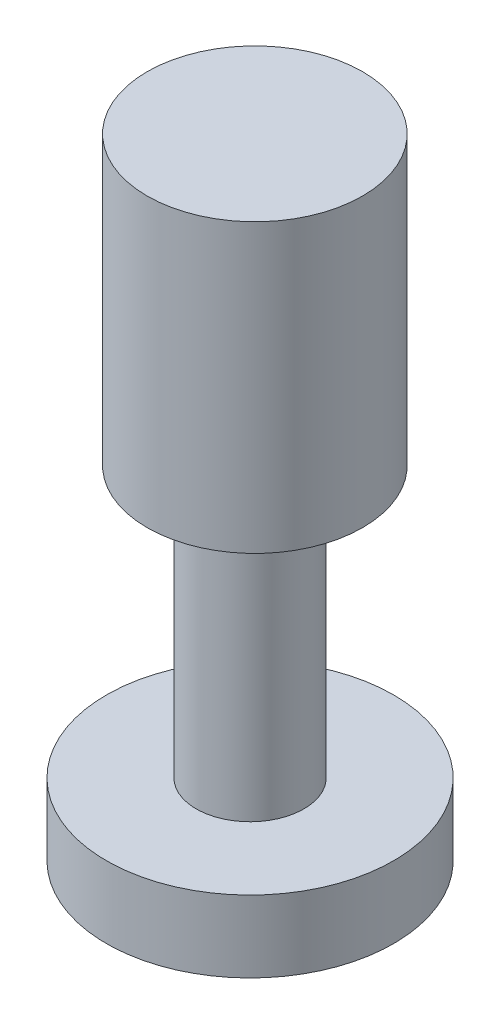
ISO-10303-21;
HEADER;
FILE_DESCRIPTION(('STEP AP214'),'2;1');
FILE_NAME('part.step','',(''),(''),'','','');
FILE_SCHEMA(('AUTOMOTIVE_DESIGN { 1 0 10303 214 1 1 1 1 }'));
ENDSEC;
DATA;
#1=APPLICATION_CONTEXT('core data for automotive mechanical design processes');
#2=APPLICATION_PROTOCOL_DEFINITION('international standard','automotive_design',2000,#1);
#3=PRODUCT_CONTEXT('',#1,'mechanical');
#4=PRODUCT('Part','Part','',(#3));
#5=PRODUCT_RELATED_PRODUCT_CATEGORY('part','',(#4));
#6=PRODUCT_DEFINITION_FORMATION('','',#4);
#7=PRODUCT_DEFINITION_CONTEXT('part definition',#1,'design');
#8=PRODUCT_DEFINITION('design','',#6,#7);
#9=PRODUCT_DEFINITION_SHAPE('','',#8);
#10=(LENGTH_UNIT() NAMED_UNIT(*) SI_UNIT(.MILLI.,.METRE.));
#11=(NAMED_UNIT(*) PLANE_ANGLE_UNIT() SI_UNIT($,.RADIAN.));
#12=(NAMED_UNIT(*) SI_UNIT($,.STERADIAN.) SOLID_ANGLE_UNIT());
#13=UNCERTAINTY_MEASURE_WITH_UNIT(LENGTH_MEASURE(1.E-05),#10,'distance_accuracy_value','');
#14=(GEOMETRIC_REPRESENTATION_CONTEXT(3) GLOBAL_UNCERTAINTY_ASSIGNED_CONTEXT((#13)) GLOBAL_UNIT_ASSIGNED_CONTEXT((#10,
#11,#12)) REPRESENTATION_CONTEXT('',''));
#15=CARTESIAN_POINT('',(0.,0.,0.));
#16=DIRECTION('',(0.,0.,1.));
#17=DIRECTION('',(1.,0.,0.));
#18=AXIS2_PLACEMENT_3D('',#15,#16,#17);
#19=CARTESIAN_POINT('',(0.,38.,0.));
#20=DIRECTION('',(0.,-1.,0.));
#21=DIRECTION('',(0.,0.,-1.));
#22=AXIS2_PLACEMENT_3D('',#19,#20,#21);
#23=CYLINDRICAL_SURFACE('',#22,7.5);
#24=CARTESIAN_POINT('',(0.,38.,0.));
#25=DIRECTION('',(0.,1.,0.));
#26=DIRECTION('',(0.,0.,1.));
#27=AXIS2_PLACEMENT_3D('',#24,#25,#26);
#28=CIRCLE('',#27,7.5);
#29=CARTESIAN_POINT('',(0.,38.,7.5));
#30=VERTEX_POINT('',#29);
#31=EDGE_CURVE('E10',#30,#30,#28,.T.);
#32=ORIENTED_EDGE('',*,*,#31,.F.);
#33=EDGE_LOOP('',(#32));
#34=FACE_BOUND('',#33,.T.);
#35=CARTESIAN_POINT('',(0.,0.,0.));
#36=DIRECTION('',(0.,-1.,0.));
#37=DIRECTION('',(0.,0.,-1.));
#38=AXIS2_PLACEMENT_3D('',#35,#36,#37);
#39=CIRCLE('',#38,7.5);
#40=CARTESIAN_POINT('',(0.,0.,-7.5));
#41=VERTEX_POINT('',#40);
#42=EDGE_CURVE('E37',#41,#41,#39,.T.);
#43=ORIENTED_EDGE('',*,*,#42,.F.);
#44=EDGE_LOOP('',(#43));
#45=FACE_BOUND('',#44,.T.);
#46=ADVANCED_FACE('F31',(#34,#45),#23,.T.);
#47=CARTESIAN_POINT('',(0.,-10.,0.));
#48=DIRECTION('',(0.,1.,0.));
#49=DIRECTION('',(0.,0.,1.));
#50=AXIS2_PLACEMENT_3D('',#47,#48,#49);
#51=CYLINDRICAL_SURFACE('',#50,20.);
#52=CARTESIAN_POINT('',(0.,-10.,0.));
#53=DIRECTION('',(0.,-1.,0.));
#54=DIRECTION('',(0.,0.,-1.));
#55=AXIS2_PLACEMENT_3D('',#52,#53,#54);
#56=CIRCLE('',#55,20.);
#57=CARTESIAN_POINT('',(0.,-10.,-20.));
#58=VERTEX_POINT('',#57);
#59=EDGE_CURVE('E41',#58,#58,#56,.T.);
#60=ORIENTED_EDGE('',*,*,#59,.F.);
#61=EDGE_LOOP('',(#60));
#62=FACE_BOUND('',#61,.T.);
#63=CARTESIAN_POINT('',(0.,0.,0.));
#64=DIRECTION('',(0.,-1.,0.));
#65=DIRECTION('',(0.,0.,-1.));
#66=AXIS2_PLACEMENT_3D('',#63,#64,#65);
#67=CIRCLE('',#66,20.);
#68=CARTESIAN_POINT('',(0.,0.,-20.));
#69=VERTEX_POINT('',#68);
#70=EDGE_CURVE('E45',#69,#69,#67,.T.);
#71=ORIENTED_EDGE('',*,*,#70,.T.);
#72=EDGE_LOOP('',(#71));
#73=FACE_BOUND('',#72,.T.);
#74=ADVANCED_FACE('F74',(#62,#73),#51,.T.);
#75=CARTESIAN_POINT('',(0.,-10.,0.));
#76=DIRECTION('',(0.,-1.,0.));
#77=DIRECTION('',(0.,0.,-1.));
#78=AXIS2_PLACEMENT_3D('',#75,#76,#77);
#79=PLANE('',#78);
#80=ORIENTED_EDGE('',*,*,#59,.T.);
#81=EDGE_LOOP('',(#80));
#82=FACE_BOUND('',#81,.T.);
#83=ADVANCED_FACE('F79',(#82),#79,.T.);
#84=CARTESIAN_POINT('',(0.,0.,0.));
#85=DIRECTION('',(0.,-1.,0.));
#86=DIRECTION('',(0.,0.,-1.));
#87=AXIS2_PLACEMENT_3D('',#84,#85,#86);
#88=PLANE('',#87);
#89=ORIENTED_EDGE('',*,*,#42,.T.);
#90=EDGE_LOOP('',(#89));
#91=FACE_BOUND('',#90,.T.);
#92=ORIENTED_EDGE('',*,*,#70,.F.);
#93=EDGE_LOOP('',(#92));
#94=FACE_BOUND('',#93,.T.);
#95=ADVANCED_FACE('F62',(#91,#94),#88,.F.);
#96=CARTESIAN_POINT('',(0.67036929567621,78.,0.));
#97=DIRECTION('',(0.,-1.,0.));
#98=DIRECTION('',(0.,0.,-1.));
#99=AXIS2_PLACEMENT_3D('',#96,#97,#98);
#100=CYLINDRICAL_SURFACE('',#99,15.);
#101=CARTESIAN_POINT('',(0.67036929567621,78.,0.));
#102=DIRECTION('',(0.,1.,0.));
#103=DIRECTION('',(0.,0.,1.));
#104=AXIS2_PLACEMENT_3D('',#101,#102,#103);
#105=CIRCLE('',#104,15.);
#106=CARTESIAN_POINT('',(0.67036929567621,78.,15.));
#107=VERTEX_POINT('',#106);
#108=EDGE_CURVE('E49',#107,#107,#105,.T.);
#109=ORIENTED_EDGE('',*,*,#108,.F.);
#110=EDGE_LOOP('',(#109));
#111=FACE_BOUND('',#110,.T.);
#112=CARTESIAN_POINT('',(0.67036929567621,38.,0.));
#113=DIRECTION('',(0.,1.,0.));
#114=DIRECTION('',(0.,0.,1.));
#115=AXIS2_PLACEMENT_3D('',#112,#113,#114);
#116=CIRCLE('',#115,15.);
#117=CARTESIAN_POINT('',(0.67036929567621,38.,15.));
#118=VERTEX_POINT('',#117);
#119=EDGE_CURVE('E51',#118,#118,#116,.T.);
#120=ORIENTED_EDGE('',*,*,#119,.T.);
#121=EDGE_LOOP('',(#120));
#122=FACE_BOUND('',#121,.T.);
#123=ADVANCED_FACE('F59',(#111,#122),#100,.T.);
#124=CARTESIAN_POINT('',(0.67036929567621,78.,0.));
#125=DIRECTION('',(0.,1.,0.));
#126=DIRECTION('',(0.,0.,1.));
#127=AXIS2_PLACEMENT_3D('',#124,#125,#126);
#128=PLANE('',#127);
#129=ORIENTED_EDGE('',*,*,#108,.T.);
#130=EDGE_LOOP('',(#129));
#131=FACE_BOUND('',#130,.T.);
#132=ADVANCED_FACE('F57',(#131),#128,.T.);
#133=CARTESIAN_POINT('',(0.67036929567621,38.,0.));
#134=DIRECTION('',(0.,1.,0.));
#135=DIRECTION('',(0.,0.,1.));
#136=AXIS2_PLACEMENT_3D('',#133,#134,#135);
#137=PLANE('',#136);
#138=ORIENTED_EDGE('',*,*,#31,.T.);
#139=EDGE_LOOP('',(#138));
#140=FACE_BOUND('',#139,.T.);
#141=ORIENTED_EDGE('',*,*,#119,.F.);
#142=EDGE_LOOP('',(#141));
#143=FACE_BOUND('',#142,.T.);
#144=ADVANCED_FACE('F66',(#140,#143),#137,.F.);
#145=CLOSED_SHELL('',(#46,#74,#83,#95,#123,#132,#144));
#146=MANIFOLD_SOLID_BREP('B2',#145);
#147=ADVANCED_BREP_SHAPE_REPRESENTATION('',(#18,#146),#14);
#148=SHAPE_DEFINITION_REPRESENTATION(#9,#147);
ENDSEC;
END-ISO-10303-21;
